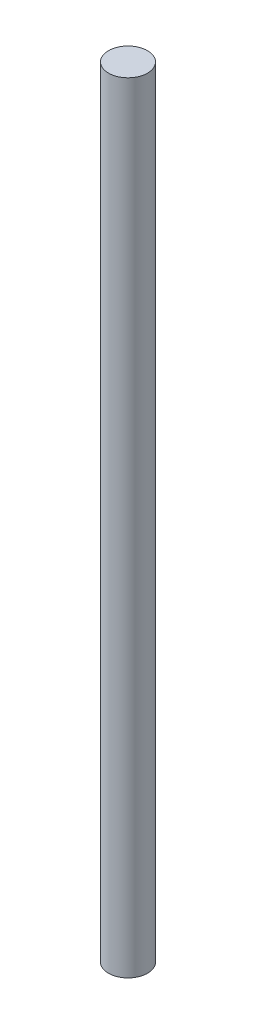
ISO-10303-21;
HEADER;
FILE_DESCRIPTION(('STEP AP214'),'2;1');
FILE_NAME('part.step','',(''),(''),'','','');
FILE_SCHEMA(('AUTOMOTIVE_DESIGN { 1 0 10303 214 1 1 1 1 }'));
ENDSEC;
DATA;
#1=APPLICATION_CONTEXT('core data for automotive mechanical design processes');
#2=APPLICATION_PROTOCOL_DEFINITION('international standard','automotive_design',2000,#1);
#3=PRODUCT_CONTEXT('',#1,'mechanical');
#4=PRODUCT('Part','Part','',(#3));
#5=PRODUCT_RELATED_PRODUCT_CATEGORY('part','',(#4));
#6=PRODUCT_DEFINITION_FORMATION('','',#4);
#7=PRODUCT_DEFINITION_CONTEXT('part definition',#1,'design');
#8=PRODUCT_DEFINITION('design','',#6,#7);
#9=PRODUCT_DEFINITION_SHAPE('','',#8);
#10=(LENGTH_UNIT() NAMED_UNIT(*) SI_UNIT(.MILLI.,.METRE.));
#11=(NAMED_UNIT(*) PLANE_ANGLE_UNIT() SI_UNIT($,.RADIAN.));
#12=(NAMED_UNIT(*) SI_UNIT($,.STERADIAN.) SOLID_ANGLE_UNIT());
#13=UNCERTAINTY_MEASURE_WITH_UNIT(LENGTH_MEASURE(1.E-05),#10,'distance_accuracy_value','');
#14=(GEOMETRIC_REPRESENTATION_CONTEXT(3) GLOBAL_UNCERTAINTY_ASSIGNED_CONTEXT((#13)) GLOBAL_UNIT_ASSIGNED_CONTEXT((#10,
#11,#12)) REPRESENTATION_CONTEXT('',''));
#15=CARTESIAN_POINT('',(0.,0.,0.));
#16=DIRECTION('',(0.,0.,1.));
#17=DIRECTION('',(1.,0.,0.));
#18=AXIS2_PLACEMENT_3D('',#15,#16,#17);
#19=CARTESIAN_POINT('',(0.,304.8,0.));
#20=DIRECTION('',(0.,-1.,0.));
#21=DIRECTION('',(0.,0.,-1.));
#22=AXIS2_PLACEMENT_3D('',#19,#20,#21);
#23=CYLINDRICAL_SURFACE('',#22,7.62);
#24=CARTESIAN_POINT('',(0.,304.8,0.));
#25=DIRECTION('',(0.,1.,0.));
#26=DIRECTION('',(0.,0.,1.));
#27=AXIS2_PLACEMENT_3D('',#24,#25,#26);
#28=CIRCLE('',#27,7.62);
#29=CARTESIAN_POINT('',(0.,304.8,-7.62));
#30=VERTEX_POINT('',#29);
#31=EDGE_CURVE('E10',#30,#30,#28,.T.);
#32=CARTESIAN_POINT('',(0.,0.,0.));
#33=DIRECTION('',(0.,1.,0.));
#34=DIRECTION('',(0.,0.,1.));
#35=AXIS2_PLACEMENT_3D('',#32,#33,#34);
#36=CIRCLE('',#35,7.62);
#37=CARTESIAN_POINT('',(0.,0.,-7.62));
#38=VERTEX_POINT('',#37);
#39=EDGE_CURVE('E36',#38,#38,#36,.T.);
#40=CARTESIAN_POINT('',(0.,304.8,-7.62));
#41=CARTESIAN_POINT('',(0.,301.625,-7.62));
#42=CARTESIAN_POINT('',(0.,298.45,-7.62));
#43=CARTESIAN_POINT('',(0.,292.1,-7.62));
#44=CARTESIAN_POINT('',(0.,288.925,-7.62));
#45=CARTESIAN_POINT('',(0.,282.575,-7.62));
#46=CARTESIAN_POINT('',(0.,279.4,-7.62));
#47=CARTESIAN_POINT('',(0.,273.05,-7.62));
#48=CARTESIAN_POINT('',(0.,269.875,-7.62));
#49=CARTESIAN_POINT('',(0.,263.525,-7.62));
#50=CARTESIAN_POINT('',(0.,260.35,-7.62));
#51=CARTESIAN_POINT('',(0.,254.,-7.62));
#52=CARTESIAN_POINT('',(0.,250.825,-7.62));
#53=CARTESIAN_POINT('',(0.,244.475,-7.62));
#54=CARTESIAN_POINT('',(0.,241.3,-7.62));
#55=CARTESIAN_POINT('',(0.,234.95,-7.62));
#56=CARTESIAN_POINT('',(0.,231.775,-7.62));
#57=CARTESIAN_POINT('',(0.,225.425,-7.62));
#58=CARTESIAN_POINT('',(0.,222.25,-7.62));
#59=CARTESIAN_POINT('',(0.,215.9,-7.62));
#60=CARTESIAN_POINT('',(0.,212.725,-7.62));
#61=CARTESIAN_POINT('',(0.,206.375,-7.62));
#62=CARTESIAN_POINT('',(0.,203.2,-7.62));
#63=CARTESIAN_POINT('',(0.,196.85,-7.62));
#64=CARTESIAN_POINT('',(0.,193.675,-7.62));
#65=CARTESIAN_POINT('',(0.,187.325,-7.62));
#66=CARTESIAN_POINT('',(0.,184.15,-7.62));
#67=CARTESIAN_POINT('',(0.,177.8,-7.62));
#68=CARTESIAN_POINT('',(0.,174.625,-7.62));
#69=CARTESIAN_POINT('',(0.,168.275,-7.62));
#70=CARTESIAN_POINT('',(0.,165.1,-7.62));
#71=CARTESIAN_POINT('',(0.,158.75,-7.62));
#72=CARTESIAN_POINT('',(0.,155.575,-7.62));
#73=CARTESIAN_POINT('',(0.,149.225,-7.62));
#74=CARTESIAN_POINT('',(0.,146.05,-7.62));
#75=CARTESIAN_POINT('',(0.,139.7,-7.62));
#76=CARTESIAN_POINT('',(0.,136.525,-7.62));
#77=CARTESIAN_POINT('',(0.,130.175,-7.62));
#78=CARTESIAN_POINT('',(0.,127.,-7.62));
#79=CARTESIAN_POINT('',(0.,120.65,-7.62));
#80=CARTESIAN_POINT('',(0.,117.475,-7.62));
#81=CARTESIAN_POINT('',(0.,111.125,-7.62));
#82=CARTESIAN_POINT('',(0.,107.95,-7.62));
#83=CARTESIAN_POINT('',(0.,101.6,-7.62));
#84=CARTESIAN_POINT('',(0.,98.425,-7.62));
#85=CARTESIAN_POINT('',(0.,92.075,-7.62));
#86=CARTESIAN_POINT('',(0.,88.9,-7.62));
#87=CARTESIAN_POINT('',(0.,82.55,-7.62));
#88=CARTESIAN_POINT('',(0.,79.375,-7.62));
#89=CARTESIAN_POINT('',(0.,73.025,-7.62));
#90=CARTESIAN_POINT('',(0.,69.85,-7.62));
#91=CARTESIAN_POINT('',(0.,63.5,-7.62));
#92=CARTESIAN_POINT('',(0.,60.325,-7.62));
#93=CARTESIAN_POINT('',(0.,53.975,-7.62));
#94=CARTESIAN_POINT('',(0.,50.8,-7.62));
#95=CARTESIAN_POINT('',(0.,44.45,-7.62));
#96=CARTESIAN_POINT('',(0.,41.275,-7.62));
#97=CARTESIAN_POINT('',(0.,34.925,-7.62));
#98=CARTESIAN_POINT('',(0.,31.75,-7.62));
#99=CARTESIAN_POINT('',(0.,25.4,-7.62));
#100=CARTESIAN_POINT('',(0.,22.225,-7.62));
#101=CARTESIAN_POINT('',(0.,15.875,-7.62));
#102=CARTESIAN_POINT('',(0.,12.7,-7.62));
#103=CARTESIAN_POINT('',(0.,6.35,-7.62));
#104=CARTESIAN_POINT('',(0.,3.175,-7.62));
#105=CARTESIAN_POINT('',(0.,0.,-7.62));
#106=B_SPLINE_CURVE_WITH_KNOTS('',3,(#40,#41,#42,#43,#44,#45,#46,#47,#48,#49,#50,#51,#52,#53,
#54,#55,#56,#57,#58,#59,#60,#61,#62,#63,#64,#65,#66,#67,#68,#69,#70,#71,#72,#73,#74,#75,#76,#77,
#78,#79,#80,#81,#82,#83,#84,#85,#86,#87,#88,#89,#90,#91,#92,#93,#94,#95,#96,#97,#98,#99,#100,
#101,#102,#103,#104,#105),.UNSPECIFIED.,.F.,.F.,(4,2,2,2,2,2,2,2,2,2,2,2,2,2,2,2,2,2,2,2,2,2,2,
2,2,2,2,2,2,2,2,2,4),(0.,9.52499999999995,19.05,28.575,38.1,47.625,57.15,66.675,76.2,85.725,
95.2499999999999,104.775,114.3,123.825,133.35,142.875,152.4,161.925,171.45,180.975,190.5,
200.025,209.55,219.075,228.6,238.125,247.65,257.175,266.7,276.225,285.75,295.275,304.8),.UNSPECIFIED.);
#107=EDGE_CURVE('BSEAM33',#30,#38,#106,.T.);
#108=ORIENTED_EDGE('',*,*,#31,.F.);
#109=ORIENTED_EDGE('',*,*,#39,.T.);
#110=ORIENTED_EDGE('',*,*,#107,.T.);
#111=ORIENTED_EDGE('',*,*,#107,.F.);
#112=EDGE_LOOP('',(#108,#110,#109,#111));
#113=FACE_BOUND('',#112,.T.);
#114=ADVANCED_FACE('F33',(#113),#23,.T.);
#115=CARTESIAN_POINT('',(0.,304.8,0.));
#116=DIRECTION('',(0.,1.,0.));
#117=DIRECTION('',(0.,0.,1.));
#118=AXIS2_PLACEMENT_3D('',#115,#116,#117);
#119=PLANE('',#118);
#120=ORIENTED_EDGE('',*,*,#31,.T.);
#121=EDGE_LOOP('',(#120));
#122=FACE_BOUND('',#121,.T.);
#123=ADVANCED_FACE('F48',(#122),#119,.T.);
#124=CARTESIAN_POINT('',(0.,0.,0.));
#125=DIRECTION('',(0.,1.,0.));
#126=DIRECTION('',(0.,0.,1.));
#127=AXIS2_PLACEMENT_3D('',#124,#125,#126);
#128=PLANE('',#127);
#129=ORIENTED_EDGE('',*,*,#39,.F.);
#130=EDGE_LOOP('',(#129));
#131=FACE_BOUND('',#130,.T.);
#132=ADVANCED_FACE('F46',(#131),#128,.F.);
#133=CLOSED_SHELL('',(#114,#123,#132));
#134=MANIFOLD_SOLID_BREP('B2',#133);
#135=ADVANCED_BREP_SHAPE_REPRESENTATION('',(#18,#134),#14);
#136=SHAPE_DEFINITION_REPRESENTATION(#9,#135);
ENDSEC;
END-ISO-10303-21;
